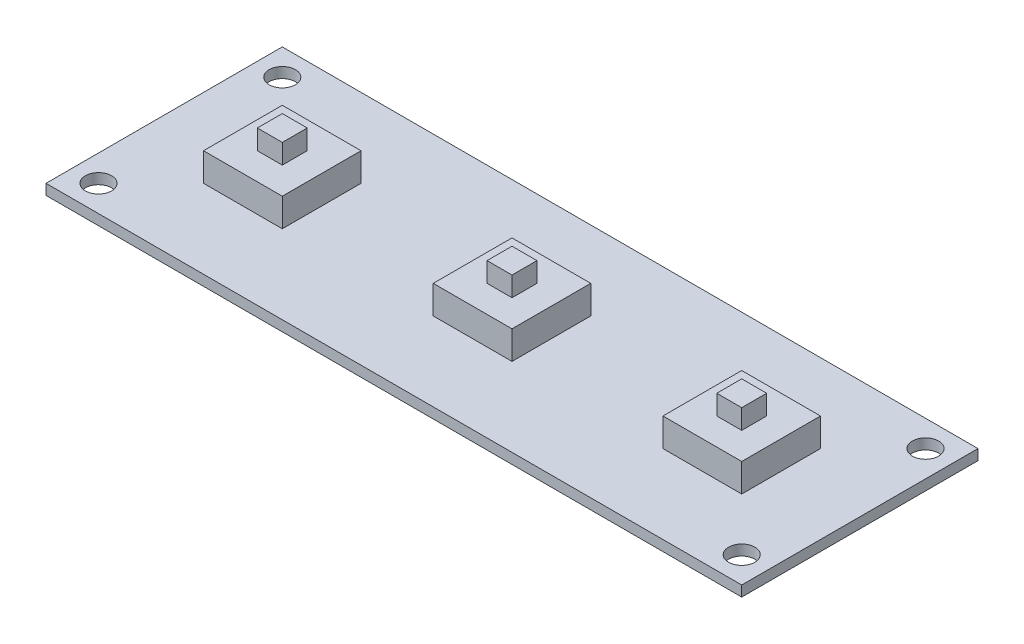
ISO-10303-21;
HEADER;
FILE_DESCRIPTION(('STEP AP214'),'2;1');
FILE_NAME('part.step','',(''),(''),'','','');
FILE_SCHEMA(('AUTOMOTIVE_DESIGN { 1 0 10303 214 1 1 1 1 }'));
ENDSEC;
DATA;
#1=APPLICATION_CONTEXT('core data for automotive mechanical design processes');
#2=APPLICATION_PROTOCOL_DEFINITION('international standard','automotive_design',2000,#1);
#3=PRODUCT_CONTEXT('',#1,'mechanical');
#4=PRODUCT('Part','Part','',(#3));
#5=PRODUCT_RELATED_PRODUCT_CATEGORY('part','',(#4));
#6=PRODUCT_DEFINITION_FORMATION('','',#4);
#7=PRODUCT_DEFINITION_CONTEXT('part definition',#1,'design');
#8=PRODUCT_DEFINITION('design','',#6,#7);
#9=PRODUCT_DEFINITION_SHAPE('','',#8);
#10=(LENGTH_UNIT() NAMED_UNIT(*) SI_UNIT(.MILLI.,.METRE.));
#11=(NAMED_UNIT(*) PLANE_ANGLE_UNIT() SI_UNIT($,.RADIAN.));
#12=(NAMED_UNIT(*) SI_UNIT($,.STERADIAN.) SOLID_ANGLE_UNIT());
#13=UNCERTAINTY_MEASURE_WITH_UNIT(LENGTH_MEASURE(1.E-05),#10,'distance_accuracy_value','');
#14=(GEOMETRIC_REPRESENTATION_CONTEXT(3) GLOBAL_UNCERTAINTY_ASSIGNED_CONTEXT((#13)) GLOBAL_UNIT_ASSIGNED_CONTEXT((#10,
#11,#12)) REPRESENTATION_CONTEXT('',''));
#15=CARTESIAN_POINT('',(0.,0.,0.));
#16=DIRECTION('',(0.,0.,1.));
#17=DIRECTION('',(1.,0.,0.));
#18=AXIS2_PLACEMENT_3D('',#15,#16,#17);
#19=CARTESIAN_POINT('',(0.,0.,0.));
#20=DIRECTION('',(0.,-1.,0.));
#21=DIRECTION('',(0.,0.,-1.));
#22=AXIS2_PLACEMENT_3D('',#19,#20,#21);
#23=PLANE('',#22);
#24=DIRECTION('',(0.,0.,1.));
#25=VECTOR('',#24,1.);
#26=CARTESIAN_POINT('',(35.,0.,-12.));
#27=LINE('',#26,#25);
#28=CARTESIAN_POINT('',(35.,0.,-12.));
#29=VERTEX_POINT('',#28);
#30=CARTESIAN_POINT('',(35.,0.,0.));
#31=VERTEX_POINT('',#30);
#32=EDGE_CURVE('E317',#29,#31,#27,.T.);
#33=ORIENTED_EDGE('',*,*,#32,.F.);
#34=DIRECTION('',(-1.,0.,0.));
#35=VECTOR('',#34,1.);
#36=CARTESIAN_POINT('',(35.,0.,-12.));
#37=LINE('',#36,#35);
#38=CARTESIAN_POINT('',(47.,0.,-12.));
#39=VERTEX_POINT('',#38);
#40=EDGE_CURVE('E322',#39,#29,#37,.T.);
#41=ORIENTED_EDGE('',*,*,#40,.F.);
#42=DIRECTION('',(0.,0.,-1.));
#43=VECTOR('',#42,1.);
#44=CARTESIAN_POINT('',(47.,0.,-12.));
#45=LINE('',#44,#43);
#46=CARTESIAN_POINT('',(47.,0.,0.));
#47=VERTEX_POINT('',#46);
#48=EDGE_CURVE('E334',#47,#39,#45,.T.);
#49=ORIENTED_EDGE('',*,*,#48,.F.);
#50=DIRECTION('',(1.,0.,0.));
#51=VECTOR('',#50,1.);
#52=CARTESIAN_POINT('',(35.,0.,0.));
#53=LINE('',#52,#51);
#54=EDGE_CURVE('E331',#31,#47,#53,.T.);
#55=ORIENTED_EDGE('',*,*,#54,.F.);
#56=EDGE_LOOP('',(#33,#41,#49,#55));
#57=FACE_BOUND('',#56,.T.);
#58=DIRECTION('',(0.,0.,1.));
#59=VECTOR('',#58,1.);
#60=CARTESIAN_POINT('',(0.,0.,0.));
#61=LINE('',#60,#59);
#62=CARTESIAN_POINT('',(0.,0.,-12.));
#63=VERTEX_POINT('',#62);
#64=CARTESIAN_POINT('',(0.,0.,0.));
#65=VERTEX_POINT('',#64);
#66=EDGE_CURVE('E435',#63,#65,#61,.T.);
#67=ORIENTED_EDGE('',*,*,#66,.F.);
#68=DIRECTION('',(-1.,0.,0.));
#69=VECTOR('',#68,1.);
#70=CARTESIAN_POINT('',(0.,0.,-12.));
#71=LINE('',#70,#69);
#72=CARTESIAN_POINT('',(12.,0.,-12.));
#73=VERTEX_POINT('',#72);
#74=EDGE_CURVE('E440',#73,#63,#71,.T.);
#75=ORIENTED_EDGE('',*,*,#74,.F.);
#76=DIRECTION('',(0.,0.,-1.));
#77=VECTOR('',#76,1.);
#78=CARTESIAN_POINT('',(12.,0.,0.));
#79=LINE('',#78,#77);
#80=CARTESIAN_POINT('',(12.,0.,0.));
#81=VERTEX_POINT('',#80);
#82=EDGE_CURVE('E452',#81,#73,#79,.T.);
#83=ORIENTED_EDGE('',*,*,#82,.F.);
#84=DIRECTION('',(1.,0.,0.));
#85=VECTOR('',#84,1.);
#86=CARTESIAN_POINT('',(0.,0.,0.));
#87=LINE('',#86,#85);
#88=EDGE_CURVE('E449',#65,#81,#87,.T.);
#89=ORIENTED_EDGE('',*,*,#88,.F.);
#90=EDGE_LOOP('',(#67,#75,#83,#89));
#91=FACE_BOUND('',#90,.T.);
#92=DIRECTION('',(0.,0.,-1.));
#93=VECTOR('',#92,1.);
#94=CARTESIAN_POINT('',(-12.,0.,12.));
#95=LINE('',#94,#93);
#96=CARTESIAN_POINT('',(-12.,0.,12.));
#97=VERTEX_POINT('',#96);
#98=CARTESIAN_POINT('',(-12.,0.,-24.));
#99=VERTEX_POINT('',#98);
#100=EDGE_CURVE('E372',#97,#99,#95,.T.);
#101=ORIENTED_EDGE('',*,*,#100,.F.);
#102=DIRECTION('',(-1.,0.,0.));
#103=VECTOR('',#102,1.);
#104=CARTESIAN_POINT('',(-12.,0.,12.));
#105=LINE('',#104,#103);
#106=CARTESIAN_POINT('',(94.,0.,12.));
#107=VERTEX_POINT('',#106);
#108=EDGE_CURVE('E379',#107,#97,#105,.T.);
#109=ORIENTED_EDGE('',*,*,#108,.F.);
#110=DIRECTION('',(0.,0.,1.));
#111=VECTOR('',#110,1.);
#112=CARTESIAN_POINT('',(94.,0.,12.));
#113=LINE('',#112,#111);
#114=CARTESIAN_POINT('',(94.,0.,-24.));
#115=VERTEX_POINT('',#114);
#116=EDGE_CURVE('E390',#115,#107,#113,.T.);
#117=ORIENTED_EDGE('',*,*,#116,.F.);
#118=DIRECTION('',(1.,0.,0.));
#119=VECTOR('',#118,1.);
#120=CARTESIAN_POINT('',(-12.,0.,-24.));
#121=LINE('',#120,#119);
#122=EDGE_CURVE('E388',#99,#115,#121,.T.);
#123=ORIENTED_EDGE('',*,*,#122,.F.);
#124=EDGE_LOOP('',(#101,#109,#117,#123));
#125=FACE_BOUND('',#124,.T.);
#126=CARTESIAN_POINT('',(-8.,0.,-20.));
#127=DIRECTION('',(0.,-1.,0.));
#128=DIRECTION('',(0.,0.,-1.));
#129=AXIS2_PLACEMENT_3D('',#126,#127,#128);
#130=CIRCLE('',#129,2.);
#131=CARTESIAN_POINT('',(-8.,0.,-22.));
#132=VERTEX_POINT('',#131);
#133=EDGE_CURVE('E366',#132,#132,#130,.T.);
#134=ORIENTED_EDGE('',*,*,#133,.T.);
#135=EDGE_LOOP('',(#134));
#136=FACE_BOUND('',#135,.T.);
#137=CARTESIAN_POINT('',(-8.,0.,8.));
#138=DIRECTION('',(0.,-1.,0.));
#139=DIRECTION('',(0.,0.,-1.));
#140=AXIS2_PLACEMENT_3D('',#137,#138,#139);
#141=CIRCLE('',#140,2.);
#142=CARTESIAN_POINT('',(-8.,0.,6.));
#143=VERTEX_POINT('',#142);
#144=EDGE_CURVE('E360',#143,#143,#141,.T.);
#145=ORIENTED_EDGE('',*,*,#144,.T.);
#146=EDGE_LOOP('',(#145));
#147=FACE_BOUND('',#146,.T.);
#148=CARTESIAN_POINT('',(90.,0.,8.));
#149=DIRECTION('',(0.,-1.,0.));
#150=DIRECTION('',(0.,0.,-1.));
#151=AXIS2_PLACEMENT_3D('',#148,#149,#150);
#152=CIRCLE('',#151,2.);
#153=CARTESIAN_POINT('',(90.,0.,6.));
#154=VERTEX_POINT('',#153);
#155=EDGE_CURVE('E354',#154,#154,#152,.T.);
#156=ORIENTED_EDGE('',*,*,#155,.T.);
#157=EDGE_LOOP('',(#156));
#158=FACE_BOUND('',#157,.T.);
#159=CARTESIAN_POINT('',(90.,0.,-20.));
#160=DIRECTION('',(0.,-1.,0.));
#161=DIRECTION('',(0.,0.,-1.));
#162=AXIS2_PLACEMENT_3D('',#159,#160,#161);
#163=CIRCLE('',#162,2.);
#164=CARTESIAN_POINT('',(90.,0.,-22.));
#165=VERTEX_POINT('',#164);
#166=EDGE_CURVE('E350',#165,#165,#163,.T.);
#167=ORIENTED_EDGE('',*,*,#166,.T.);
#168=EDGE_LOOP('',(#167));
#169=FACE_BOUND('',#168,.T.);
#170=DIRECTION('',(0.,0.,1.));
#171=VECTOR('',#170,1.);
#172=CARTESIAN_POINT('',(70.,0.,-12.));
#173=LINE('',#172,#171);
#174=CARTESIAN_POINT('',(70.,0.,-12.));
#175=VERTEX_POINT('',#174);
#176=CARTESIAN_POINT('',(70.,0.,0.));
#177=VERTEX_POINT('',#176);
#178=EDGE_CURVE('E284',#175,#177,#173,.T.);
#179=ORIENTED_EDGE('',*,*,#178,.F.);
#180=DIRECTION('',(-1.,0.,0.));
#181=VECTOR('',#180,1.);
#182=CARTESIAN_POINT('',(70.,0.,-12.));
#183=LINE('',#182,#181);
#184=CARTESIAN_POINT('',(82.,0.,-12.));
#185=VERTEX_POINT('',#184);
#186=EDGE_CURVE('E289',#185,#175,#183,.T.);
#187=ORIENTED_EDGE('',*,*,#186,.F.);
#188=DIRECTION('',(0.,0.,-1.));
#189=VECTOR('',#188,1.);
#190=CARTESIAN_POINT('',(82.,0.,-12.));
#191=LINE('',#190,#189);
#192=CARTESIAN_POINT('',(82.,0.,0.));
#193=VERTEX_POINT('',#192);
#194=EDGE_CURVE('E301',#193,#185,#191,.T.);
#195=ORIENTED_EDGE('',*,*,#194,.F.);
#196=DIRECTION('',(1.,0.,0.));
#197=VECTOR('',#196,1.);
#198=CARTESIAN_POINT('',(70.,0.,0.));
#199=LINE('',#198,#197);
#200=EDGE_CURVE('E298',#177,#193,#199,.T.);
#201=ORIENTED_EDGE('',*,*,#200,.F.);
#202=EDGE_LOOP('',(#179,#187,#195,#201));
#203=FACE_BOUND('',#202,.T.);
#204=ADVANCED_FACE('F36',(#57,#91,#125,#136,#147,#158,#169,#203),#23,.F.);
#205=CARTESIAN_POINT('',(0.,4.3,0.));
#206=DIRECTION('',(1.,0.,0.));
#207=DIRECTION('',(0.,0.,-1.));
#208=AXIS2_PLACEMENT_3D('',#205,#206,#207);
#209=PLANE('',#208);
#210=ORIENTED_EDGE('',*,*,#66,.T.);
#211=DIRECTION('',(0.,-1.,0.));
#212=VECTOR('',#211,1.);
#213=CARTESIAN_POINT('',(0.,4.3,0.));
#214=LINE('',#213,#212);
#215=CARTESIAN_POINT('',(0.,4.3,0.));
#216=VERTEX_POINT('',#215);
#217=EDGE_CURVE('E11',#216,#65,#214,.T.);
#218=ORIENTED_EDGE('',*,*,#217,.F.);
#219=DIRECTION('',(0.,0.,1.));
#220=VECTOR('',#219,1.);
#221=CARTESIAN_POINT('',(0.,4.3,0.));
#222=LINE('',#221,#220);
#223=CARTESIAN_POINT('',(0.,4.3,-12.));
#224=VERTEX_POINT('',#223);
#225=EDGE_CURVE('E436',#224,#216,#222,.T.);
#226=ORIENTED_EDGE('',*,*,#225,.F.);
#227=DIRECTION('',(0.,-1.,0.));
#228=VECTOR('',#227,1.);
#229=CARTESIAN_POINT('',(0.,4.3,-12.));
#230=LINE('',#229,#228);
#231=EDGE_CURVE('E446',#224,#63,#230,.T.);
#232=ORIENTED_EDGE('',*,*,#231,.T.);
#233=EDGE_LOOP('',(#210,#218,#226,#232));
#234=FACE_BOUND('',#233,.T.);
#235=ADVANCED_FACE('F38',(#234),#209,.F.);
#236=CARTESIAN_POINT('',(0.,4.3,0.));
#237=DIRECTION('',(0.,0.,-1.));
#238=DIRECTION('',(-1.,0.,0.));
#239=AXIS2_PLACEMENT_3D('',#236,#237,#238);
#240=PLANE('',#239);
#241=ORIENTED_EDGE('',*,*,#88,.T.);
#242=DIRECTION('',(0.,-1.,0.));
#243=VECTOR('',#242,1.);
#244=CARTESIAN_POINT('',(12.,4.3,0.));
#245=LINE('',#244,#243);
#246=CARTESIAN_POINT('',(12.,4.3,0.));
#247=VERTEX_POINT('',#246);
#248=EDGE_CURVE('E44',#247,#81,#245,.T.);
#249=ORIENTED_EDGE('',*,*,#248,.F.);
#250=DIRECTION('',(1.,0.,0.));
#251=VECTOR('',#250,1.);
#252=CARTESIAN_POINT('',(0.,4.3,0.));
#253=LINE('',#252,#251);
#254=EDGE_CURVE('E439',#216,#247,#253,.T.);
#255=ORIENTED_EDGE('',*,*,#254,.F.);
#256=ORIENTED_EDGE('',*,*,#217,.T.);
#257=EDGE_LOOP('',(#241,#249,#255,#256));
#258=FACE_BOUND('',#257,.T.);
#259=ADVANCED_FACE('F468',(#258),#240,.F.);
#260=CARTESIAN_POINT('',(12.,4.3,0.));
#261=DIRECTION('',(-1.,0.,0.));
#262=DIRECTION('',(0.,0.,1.));
#263=AXIS2_PLACEMENT_3D('',#260,#261,#262);
#264=PLANE('',#263);
#265=ORIENTED_EDGE('',*,*,#82,.T.);
#266=DIRECTION('',(0.,-1.,0.));
#267=VECTOR('',#266,1.);
#268=CARTESIAN_POINT('',(12.,4.3,-12.));
#269=LINE('',#268,#267);
#270=CARTESIAN_POINT('',(12.,4.3,-12.));
#271=VERTEX_POINT('',#270);
#272=EDGE_CURVE('E459',#271,#73,#269,.T.);
#273=ORIENTED_EDGE('',*,*,#272,.F.);
#274=DIRECTION('',(0.,0.,-1.));
#275=VECTOR('',#274,1.);
#276=CARTESIAN_POINT('',(12.,4.3,0.));
#277=LINE('',#276,#275);
#278=EDGE_CURVE('E442',#247,#271,#277,.T.);
#279=ORIENTED_EDGE('',*,*,#278,.F.);
#280=ORIENTED_EDGE('',*,*,#248,.T.);
#281=EDGE_LOOP('',(#265,#273,#279,#280));
#282=FACE_BOUND('',#281,.T.);
#283=ADVANCED_FACE('F465',(#282),#264,.F.);
#284=CARTESIAN_POINT('',(0.,4.3,-12.));
#285=DIRECTION('',(0.,0.,1.));
#286=DIRECTION('',(1.,0.,0.));
#287=AXIS2_PLACEMENT_3D('',#284,#285,#286);
#288=PLANE('',#287);
#289=ORIENTED_EDGE('',*,*,#74,.T.);
#290=ORIENTED_EDGE('',*,*,#231,.F.);
#291=DIRECTION('',(-1.,0.,0.));
#292=VECTOR('',#291,1.);
#293=CARTESIAN_POINT('',(0.,4.3,-12.));
#294=LINE('',#293,#292);
#295=EDGE_CURVE('E444',#271,#224,#294,.T.);
#296=ORIENTED_EDGE('',*,*,#295,.F.);
#297=ORIENTED_EDGE('',*,*,#272,.T.);
#298=EDGE_LOOP('',(#289,#290,#296,#297));
#299=FACE_BOUND('',#298,.T.);
#300=ADVANCED_FACE('F474',(#299),#288,.F.);
#301=CARTESIAN_POINT('',(0.,4.3,0.));
#302=DIRECTION('',(0.,-1.,0.));
#303=DIRECTION('',(0.,0.,-1.));
#304=AXIS2_PLACEMENT_3D('',#301,#302,#303);
#305=PLANE('',#304);
#306=DIRECTION('',(1.,0.,0.));
#307=VECTOR('',#306,1.);
#308=CARTESIAN_POINT('',(0.,4.3,-7.9));
#309=LINE('',#308,#307);
#310=CARTESIAN_POINT('',(4.1,4.3,-7.9));
#311=VERTEX_POINT('',#310);
#312=CARTESIAN_POINT('',(7.9,4.3,-7.9));
#313=VERTEX_POINT('',#312);
#314=EDGE_CURVE('E419',#311,#313,#309,.T.);
#315=ORIENTED_EDGE('',*,*,#314,.T.);
#316=DIRECTION('',(0.,0.,1.));
#317=VECTOR('',#316,1.);
#318=CARTESIAN_POINT('',(7.9,4.3,0.));
#319=LINE('',#318,#317);
#320=CARTESIAN_POINT('',(7.9,4.3,-4.1));
#321=VERTEX_POINT('',#320);
#322=EDGE_CURVE('E404',#313,#321,#319,.T.);
#323=ORIENTED_EDGE('',*,*,#322,.T.);
#324=DIRECTION('',(1.,0.,0.));
#325=VECTOR('',#324,1.);
#326=CARTESIAN_POINT('',(0.,4.3,-4.1));
#327=LINE('',#326,#325);
#328=CARTESIAN_POINT('',(4.1,4.3,-4.1));
#329=VERTEX_POINT('',#328);
#330=EDGE_CURVE('E409',#329,#321,#327,.T.);
#331=ORIENTED_EDGE('',*,*,#330,.F.);
#332=DIRECTION('',(0.,0.,1.));
#333=VECTOR('',#332,1.);
#334=CARTESIAN_POINT('',(4.1,4.3,0.));
#335=LINE('',#334,#333);
#336=EDGE_CURVE('E422',#311,#329,#335,.T.);
#337=ORIENTED_EDGE('',*,*,#336,.F.);
#338=EDGE_LOOP('',(#315,#323,#331,#337));
#339=FACE_BOUND('',#338,.T.);
#340=ORIENTED_EDGE('',*,*,#225,.T.);
#341=ORIENTED_EDGE('',*,*,#254,.T.);
#342=ORIENTED_EDGE('',*,*,#278,.T.);
#343=ORIENTED_EDGE('',*,*,#295,.T.);
#344=EDGE_LOOP('',(#340,#341,#342,#343));
#345=FACE_BOUND('',#344,.T.);
#346=ADVANCED_FACE('F479',(#339,#345),#305,.F.);
#347=CARTESIAN_POINT('',(7.9,7.3,0.));
#348=DIRECTION('',(1.,0.,0.));
#349=DIRECTION('',(0.,0.,-1.));
#350=AXIS2_PLACEMENT_3D('',#347,#348,#349);
#351=PLANE('',#350);
#352=ORIENTED_EDGE('',*,*,#322,.F.);
#353=DIRECTION('',(0.,-1.,0.));
#354=VECTOR('',#353,1.);
#355=CARTESIAN_POINT('',(7.9,7.3,-7.9));
#356=LINE('',#355,#354);
#357=CARTESIAN_POINT('',(7.9,7.3,-7.9));
#358=VERTEX_POINT('',#357);
#359=EDGE_CURVE('E432',#358,#313,#356,.T.);
#360=ORIENTED_EDGE('',*,*,#359,.F.);
#361=DIRECTION('',(0.,0.,1.));
#362=VECTOR('',#361,1.);
#363=CARTESIAN_POINT('',(7.9,7.3,0.));
#364=LINE('',#363,#362);
#365=CARTESIAN_POINT('',(7.9,7.3,-4.1));
#366=VERTEX_POINT('',#365);
#367=EDGE_CURVE('E405',#358,#366,#364,.T.);
#368=ORIENTED_EDGE('',*,*,#367,.T.);
#369=DIRECTION('',(0.,-1.,0.));
#370=VECTOR('',#369,1.);
#371=CARTESIAN_POINT('',(7.9,7.3,-4.1));
#372=LINE('',#371,#370);
#373=EDGE_CURVE('E416',#366,#321,#372,.T.);
#374=ORIENTED_EDGE('',*,*,#373,.T.);
#375=EDGE_LOOP('',(#352,#360,#368,#374));
#376=FACE_BOUND('',#375,.T.);
#377=ADVANCED_FACE('F481',(#376),#351,.T.);
#378=CARTESIAN_POINT('',(0.,7.3,-7.9));
#379=DIRECTION('',(0.,0.,-1.));
#380=DIRECTION('',(-1.,0.,0.));
#381=AXIS2_PLACEMENT_3D('',#378,#379,#380);
#382=PLANE('',#381);
#383=ORIENTED_EDGE('',*,*,#314,.F.);
#384=DIRECTION('',(0.,-1.,0.));
#385=VECTOR('',#384,1.);
#386=CARTESIAN_POINT('',(4.1,7.3,-7.9));
#387=LINE('',#386,#385);
#388=CARTESIAN_POINT('',(4.1,7.3,-7.9));
#389=VERTEX_POINT('',#388);
#390=EDGE_CURVE('E430',#389,#311,#387,.T.);
#391=ORIENTED_EDGE('',*,*,#390,.F.);
#392=DIRECTION('',(1.,0.,0.));
#393=VECTOR('',#392,1.);
#394=CARTESIAN_POINT('',(0.,7.3,-7.9));
#395=LINE('',#394,#393);
#396=EDGE_CURVE('E408',#389,#358,#395,.T.);
#397=ORIENTED_EDGE('',*,*,#396,.T.);
#398=ORIENTED_EDGE('',*,*,#359,.T.);
#399=EDGE_LOOP('',(#383,#391,#397,#398));
#400=FACE_BOUND('',#399,.T.);
#401=ADVANCED_FACE('F488',(#400),#382,.T.);
#402=CARTESIAN_POINT('',(4.1,7.3,0.));
#403=DIRECTION('',(1.,0.,0.));
#404=DIRECTION('',(0.,0.,-1.));
#405=AXIS2_PLACEMENT_3D('',#402,#403,#404);
#406=PLANE('',#405);
#407=ORIENTED_EDGE('',*,*,#336,.T.);
#408=DIRECTION('',(0.,-1.,0.));
#409=VECTOR('',#408,1.);
#410=CARTESIAN_POINT('',(4.1,7.3,-4.1));
#411=LINE('',#410,#409);
#412=CARTESIAN_POINT('',(4.1,7.3,-4.1));
#413=VERTEX_POINT('',#412);
#414=EDGE_CURVE('E427',#413,#329,#411,.T.);
#415=ORIENTED_EDGE('',*,*,#414,.F.);
#416=DIRECTION('',(0.,0.,1.));
#417=VECTOR('',#416,1.);
#418=CARTESIAN_POINT('',(4.1,7.3,0.));
#419=LINE('',#418,#417);
#420=EDGE_CURVE('E412',#389,#413,#419,.T.);
#421=ORIENTED_EDGE('',*,*,#420,.F.);
#422=ORIENTED_EDGE('',*,*,#390,.T.);
#423=EDGE_LOOP('',(#407,#415,#421,#422));
#424=FACE_BOUND('',#423,.T.);
#425=ADVANCED_FACE('F526',(#424),#406,.F.);
#426=CARTESIAN_POINT('',(0.,7.3,-4.1));
#427=DIRECTION('',(0.,0.,-1.));
#428=DIRECTION('',(-1.,0.,0.));
#429=AXIS2_PLACEMENT_3D('',#426,#427,#428);
#430=PLANE('',#429);
#431=ORIENTED_EDGE('',*,*,#330,.T.);
#432=ORIENTED_EDGE('',*,*,#373,.F.);
#433=DIRECTION('',(1.,0.,0.));
#434=VECTOR('',#433,1.);
#435=CARTESIAN_POINT('',(0.,7.3,-4.1));
#436=LINE('',#435,#434);
#437=EDGE_CURVE('E414',#413,#366,#436,.T.);
#438=ORIENTED_EDGE('',*,*,#437,.F.);
#439=ORIENTED_EDGE('',*,*,#414,.T.);
#440=EDGE_LOOP('',(#431,#432,#438,#439));
#441=FACE_BOUND('',#440,.T.);
#442=ADVANCED_FACE('F522',(#441),#430,.F.);
#443=CARTESIAN_POINT('',(0.,7.3,0.));
#444=DIRECTION('',(0.,1.,0.));
#445=DIRECTION('',(0.,0.,1.));
#446=AXIS2_PLACEMENT_3D('',#443,#444,#445);
#447=PLANE('',#446);
#448=ORIENTED_EDGE('',*,*,#367,.F.);
#449=ORIENTED_EDGE('',*,*,#396,.F.);
#450=ORIENTED_EDGE('',*,*,#420,.T.);
#451=ORIENTED_EDGE('',*,*,#437,.T.);
#452=EDGE_LOOP('',(#448,#449,#450,#451));
#453=FACE_BOUND('',#452,.T.);
#454=ADVANCED_FACE('F519',(#453),#447,.T.);
#455=CARTESIAN_POINT('',(0.,-1.6,0.));
#456=DIRECTION('',(0.,-1.,0.));
#457=DIRECTION('',(0.,0.,-1.));
#458=AXIS2_PLACEMENT_3D('',#455,#456,#457);
#459=PLANE('',#458);
#460=CARTESIAN_POINT('',(90.,-1.6,8.));
#461=DIRECTION('',(0.,-1.,0.));
#462=DIRECTION('',(0.,0.,-1.));
#463=AXIS2_PLACEMENT_3D('',#460,#461,#462);
#464=CIRCLE('',#463,2.);
#465=CARTESIAN_POINT('',(90.,-1.6,6.));
#466=VERTEX_POINT('',#465);
#467=EDGE_CURVE('E357',#466,#466,#464,.T.);
#468=ORIENTED_EDGE('',*,*,#467,.F.);
#469=EDGE_LOOP('',(#468));
#470=FACE_BOUND('',#469,.T.);
#471=CARTESIAN_POINT('',(-8.,-1.6,-20.));
#472=DIRECTION('',(0.,-1.,0.));
#473=DIRECTION('',(0.,0.,-1.));
#474=AXIS2_PLACEMENT_3D('',#471,#472,#473);
#475=CIRCLE('',#474,2.);
#476=CARTESIAN_POINT('',(-8.,-1.6,-22.));
#477=VERTEX_POINT('',#476);
#478=EDGE_CURVE('E369',#477,#477,#475,.T.);
#479=ORIENTED_EDGE('',*,*,#478,.F.);
#480=EDGE_LOOP('',(#479));
#481=FACE_BOUND('',#480,.T.);
#482=DIRECTION('',(0.,0.,-1.));
#483=VECTOR('',#482,1.);
#484=CARTESIAN_POINT('',(-12.,-1.6,12.));
#485=LINE('',#484,#483);
#486=CARTESIAN_POINT('',(-12.,-1.6,12.));
#487=VERTEX_POINT('',#486);
#488=CARTESIAN_POINT('',(-12.,-1.6,-24.));
#489=VERTEX_POINT('',#488);
#490=EDGE_CURVE('E375',#487,#489,#485,.T.);
#491=ORIENTED_EDGE('',*,*,#490,.T.);
#492=DIRECTION('',(1.,0.,0.));
#493=VECTOR('',#492,1.);
#494=CARTESIAN_POINT('',(-12.,-1.6,-24.));
#495=LINE('',#494,#493);
#496=CARTESIAN_POINT('',(94.,-1.6,-24.));
#497=VERTEX_POINT('',#496);
#498=EDGE_CURVE('E378',#489,#497,#495,.T.);
#499=ORIENTED_EDGE('',*,*,#498,.T.);
#500=DIRECTION('',(0.,0.,1.));
#501=VECTOR('',#500,1.);
#502=CARTESIAN_POINT('',(94.,-1.6,12.));
#503=LINE('',#502,#501);
#504=CARTESIAN_POINT('',(94.,-1.6,12.));
#505=VERTEX_POINT('',#504);
#506=EDGE_CURVE('E381',#497,#505,#503,.T.);
#507=ORIENTED_EDGE('',*,*,#506,.T.);
#508=DIRECTION('',(-1.,0.,0.));
#509=VECTOR('',#508,1.);
#510=CARTESIAN_POINT('',(-12.,-1.6,12.));
#511=LINE('',#510,#509);
#512=EDGE_CURVE('E383',#505,#487,#511,.T.);
#513=ORIENTED_EDGE('',*,*,#512,.T.);
#514=EDGE_LOOP('',(#491,#499,#507,#513));
#515=FACE_BOUND('',#514,.T.);
#516=CARTESIAN_POINT('',(-8.,-1.6,8.));
#517=DIRECTION('',(0.,-1.,0.));
#518=DIRECTION('',(0.,0.,-1.));
#519=AXIS2_PLACEMENT_3D('',#516,#517,#518);
#520=CIRCLE('',#519,2.);
#521=CARTESIAN_POINT('',(-8.,-1.6,6.));
#522=VERTEX_POINT('',#521);
#523=EDGE_CURVE('E363',#522,#522,#520,.T.);
#524=ORIENTED_EDGE('',*,*,#523,.F.);
#525=EDGE_LOOP('',(#524));
#526=FACE_BOUND('',#525,.T.);
#527=CARTESIAN_POINT('',(90.,-1.6,-20.));
#528=DIRECTION('',(0.,-1.,0.));
#529=DIRECTION('',(0.,0.,-1.));
#530=AXIS2_PLACEMENT_3D('',#527,#528,#529);
#531=CIRCLE('',#530,2.);
#532=CARTESIAN_POINT('',(90.,-1.6,-22.));
#533=VERTEX_POINT('',#532);
#534=EDGE_CURVE('E351',#533,#533,#531,.T.);
#535=ORIENTED_EDGE('',*,*,#534,.F.);
#536=EDGE_LOOP('',(#535));
#537=FACE_BOUND('',#536,.T.);
#538=ADVANCED_FACE('F500',(#470,#481,#515,#526,#537),#459,.T.);
#539=CARTESIAN_POINT('',(-12.,-1.6,12.));
#540=DIRECTION('',(1.,0.,0.));
#541=DIRECTION('',(0.,0.,-1.));
#542=AXIS2_PLACEMENT_3D('',#539,#540,#541);
#543=PLANE('',#542);
#544=ORIENTED_EDGE('',*,*,#100,.T.);
#545=DIRECTION('',(0.,1.,0.));
#546=VECTOR('',#545,1.);
#547=CARTESIAN_POINT('',(-12.,-1.6,-24.));
#548=LINE('',#547,#546);
#549=EDGE_CURVE('E401',#489,#99,#548,.T.);
#550=ORIENTED_EDGE('',*,*,#549,.F.);
#551=ORIENTED_EDGE('',*,*,#490,.F.);
#552=DIRECTION('',(0.,1.,0.));
#553=VECTOR('',#552,1.);
#554=CARTESIAN_POINT('',(-12.,-1.6,12.));
#555=LINE('',#554,#553);
#556=EDGE_CURVE('E385',#487,#97,#555,.T.);
#557=ORIENTED_EDGE('',*,*,#556,.T.);
#558=EDGE_LOOP('',(#544,#550,#551,#557));
#559=FACE_BOUND('',#558,.T.);
#560=ADVANCED_FACE('F514',(#559),#543,.F.);
#561=CARTESIAN_POINT('',(-12.,-1.6,-24.));
#562=DIRECTION('',(0.,0.,1.));
#563=DIRECTION('',(1.,0.,0.));
#564=AXIS2_PLACEMENT_3D('',#561,#562,#563);
#565=PLANE('',#564);
#566=ORIENTED_EDGE('',*,*,#122,.T.);
#567=DIRECTION('',(0.,1.,0.));
#568=VECTOR('',#567,1.);
#569=CARTESIAN_POINT('',(94.,-1.6,-24.));
#570=LINE('',#569,#568);
#571=EDGE_CURVE('E398',#497,#115,#570,.T.);
#572=ORIENTED_EDGE('',*,*,#571,.F.);
#573=ORIENTED_EDGE('',*,*,#498,.F.);
#574=ORIENTED_EDGE('',*,*,#549,.T.);
#575=EDGE_LOOP('',(#566,#572,#573,#574));
#576=FACE_BOUND('',#575,.T.);
#577=ADVANCED_FACE('F510',(#576),#565,.F.);
#578=CARTESIAN_POINT('',(94.,-1.6,12.));
#579=DIRECTION('',(-1.,0.,0.));
#580=DIRECTION('',(0.,0.,1.));
#581=AXIS2_PLACEMENT_3D('',#578,#579,#580);
#582=PLANE('',#581);
#583=ORIENTED_EDGE('',*,*,#116,.T.);
#584=DIRECTION('',(0.,1.,0.));
#585=VECTOR('',#584,1.);
#586=CARTESIAN_POINT('',(94.,-1.6,12.));
#587=LINE('',#586,#585);
#588=EDGE_CURVE('E395',#505,#107,#587,.T.);
#589=ORIENTED_EDGE('',*,*,#588,.F.);
#590=ORIENTED_EDGE('',*,*,#506,.F.);
#591=ORIENTED_EDGE('',*,*,#571,.T.);
#592=EDGE_LOOP('',(#583,#589,#590,#591));
#593=FACE_BOUND('',#592,.T.);
#594=ADVANCED_FACE('F506',(#593),#582,.F.);
#595=CARTESIAN_POINT('',(-12.,-1.6,12.));
#596=DIRECTION('',(0.,0.,-1.));
#597=DIRECTION('',(-1.,0.,0.));
#598=AXIS2_PLACEMENT_3D('',#595,#596,#597);
#599=PLANE('',#598);
#600=ORIENTED_EDGE('',*,*,#108,.T.);
#601=ORIENTED_EDGE('',*,*,#556,.F.);
#602=ORIENTED_EDGE('',*,*,#512,.F.);
#603=ORIENTED_EDGE('',*,*,#588,.T.);
#604=EDGE_LOOP('',(#600,#601,#602,#603));
#605=FACE_BOUND('',#604,.T.);
#606=ADVANCED_FACE('F502',(#605),#599,.F.);
#607=CARTESIAN_POINT('',(-8.,-1.6,-20.));
#608=DIRECTION('',(0.,1.,0.));
#609=DIRECTION('',(0.,0.,1.));
#610=AXIS2_PLACEMENT_3D('',#607,#608,#609);
#611=CYLINDRICAL_SURFACE('',#610,2.);
#612=ORIENTED_EDGE('',*,*,#478,.T.);
#613=EDGE_LOOP('',(#612));
#614=FACE_BOUND('',#613,.T.);
#615=ORIENTED_EDGE('',*,*,#133,.F.);
#616=EDGE_LOOP('',(#615));
#617=FACE_BOUND('',#616,.T.);
#618=ADVANCED_FACE('F505',(#614,#617),#611,.F.);
#619=CARTESIAN_POINT('',(-8.,-1.6,8.));
#620=DIRECTION('',(0.,1.,0.));
#621=DIRECTION('',(0.,0.,1.));
#622=AXIS2_PLACEMENT_3D('',#619,#620,#621);
#623=CYLINDRICAL_SURFACE('',#622,2.);
#624=ORIENTED_EDGE('',*,*,#523,.T.);
#625=EDGE_LOOP('',(#624));
#626=FACE_BOUND('',#625,.T.);
#627=ORIENTED_EDGE('',*,*,#144,.F.);
#628=EDGE_LOOP('',(#627));
#629=FACE_BOUND('',#628,.T.);
#630=ADVANCED_FACE('F588',(#626,#629),#623,.F.);
#631=CARTESIAN_POINT('',(90.,-1.6,8.));
#632=DIRECTION('',(0.,1.,0.));
#633=DIRECTION('',(0.,0.,1.));
#634=AXIS2_PLACEMENT_3D('',#631,#632,#633);
#635=CYLINDRICAL_SURFACE('',#634,2.);
#636=ORIENTED_EDGE('',*,*,#467,.T.);
#637=EDGE_LOOP('',(#636));
#638=FACE_BOUND('',#637,.T.);
#639=ORIENTED_EDGE('',*,*,#155,.F.);
#640=EDGE_LOOP('',(#639));
#641=FACE_BOUND('',#640,.T.);
#642=ADVANCED_FACE('F595',(#638,#641),#635,.F.);
#643=CARTESIAN_POINT('',(90.,-1.6,-20.));
#644=DIRECTION('',(0.,1.,0.));
#645=DIRECTION('',(0.,0.,1.));
#646=AXIS2_PLACEMENT_3D('',#643,#644,#645);
#647=CYLINDRICAL_SURFACE('',#646,2.);
#648=ORIENTED_EDGE('',*,*,#534,.T.);
#649=EDGE_LOOP('',(#648));
#650=FACE_BOUND('',#649,.T.);
#651=ORIENTED_EDGE('',*,*,#166,.F.);
#652=EDGE_LOOP('',(#651));
#653=FACE_BOUND('',#652,.T.);
#654=ADVANCED_FACE('F603',(#650,#653),#647,.F.);
#655=CARTESIAN_POINT('',(35.,4.3,-12.));
#656=DIRECTION('',(1.,0.,0.));
#657=DIRECTION('',(0.,0.,-1.));
#658=AXIS2_PLACEMENT_3D('',#655,#656,#657);
#659=PLANE('',#658);
#660=ORIENTED_EDGE('',*,*,#32,.T.);
#661=DIRECTION('',(0.,-1.,0.));
#662=VECTOR('',#661,1.);
#663=CARTESIAN_POINT('',(35.,4.3,0.));
#664=LINE('',#663,#662);
#665=CARTESIAN_POINT('',(35.,4.3,0.));
#666=VERTEX_POINT('',#665);
#667=EDGE_CURVE('E347',#666,#31,#664,.T.);
#668=ORIENTED_EDGE('',*,*,#667,.F.);
#669=DIRECTION('',(0.,0.,1.));
#670=VECTOR('',#669,1.);
#671=CARTESIAN_POINT('',(35.,4.3,-12.));
#672=LINE('',#671,#670);
#673=CARTESIAN_POINT('',(35.,4.3,-12.));
#674=VERTEX_POINT('',#673);
#675=EDGE_CURVE('E318',#674,#666,#672,.T.);
#676=ORIENTED_EDGE('',*,*,#675,.F.);
#677=DIRECTION('',(0.,-1.,0.));
#678=VECTOR('',#677,1.);
#679=CARTESIAN_POINT('',(35.,4.3,-12.));
#680=LINE('',#679,#678);
#681=EDGE_CURVE('E328',#674,#29,#680,.T.);
#682=ORIENTED_EDGE('',*,*,#681,.T.);
#683=EDGE_LOOP('',(#660,#668,#676,#682));
#684=FACE_BOUND('',#683,.T.);
#685=ADVANCED_FACE('F611',(#684),#659,.F.);
#686=CARTESIAN_POINT('',(35.,4.3,0.));
#687=DIRECTION('',(0.,0.,-1.));
#688=DIRECTION('',(-1.,0.,0.));
#689=AXIS2_PLACEMENT_3D('',#686,#687,#688);
#690=PLANE('',#689);
#691=ORIENTED_EDGE('',*,*,#54,.T.);
#692=DIRECTION('',(0.,-1.,0.));
#693=VECTOR('',#692,1.);
#694=CARTESIAN_POINT('',(47.,4.3,0.));
#695=LINE('',#694,#693);
#696=CARTESIAN_POINT('',(47.,4.3,0.));
#697=VERTEX_POINT('',#696);
#698=EDGE_CURVE('E344',#697,#47,#695,.T.);
#699=ORIENTED_EDGE('',*,*,#698,.F.);
#700=DIRECTION('',(1.,0.,0.));
#701=VECTOR('',#700,1.);
#702=CARTESIAN_POINT('',(35.,4.3,0.));
#703=LINE('',#702,#701);
#704=EDGE_CURVE('E321',#666,#697,#703,.T.);
#705=ORIENTED_EDGE('',*,*,#704,.F.);
#706=ORIENTED_EDGE('',*,*,#667,.T.);
#707=EDGE_LOOP('',(#691,#699,#705,#706));
#708=FACE_BOUND('',#707,.T.);
#709=ADVANCED_FACE('F619',(#708),#690,.F.);
#710=CARTESIAN_POINT('',(47.,4.3,-12.));
#711=DIRECTION('',(-1.,0.,0.));
#712=DIRECTION('',(0.,0.,1.));
#713=AXIS2_PLACEMENT_3D('',#710,#711,#712);
#714=PLANE('',#713);
#715=ORIENTED_EDGE('',*,*,#48,.T.);
#716=DIRECTION('',(0.,-1.,0.));
#717=VECTOR('',#716,1.);
#718=CARTESIAN_POINT('',(47.,4.3,-12.));
#719=LINE('',#718,#717);
#720=CARTESIAN_POINT('',(47.,4.3,-12.));
#721=VERTEX_POINT('',#720);
#722=EDGE_CURVE('E341',#721,#39,#719,.T.);
#723=ORIENTED_EDGE('',*,*,#722,.F.);
#724=DIRECTION('',(0.,0.,-1.));
#725=VECTOR('',#724,1.);
#726=CARTESIAN_POINT('',(47.,4.3,-12.));
#727=LINE('',#726,#725);
#728=EDGE_CURVE('E324',#697,#721,#727,.T.);
#729=ORIENTED_EDGE('',*,*,#728,.F.);
#730=ORIENTED_EDGE('',*,*,#698,.T.);
#731=EDGE_LOOP('',(#715,#723,#729,#730));
#732=FACE_BOUND('',#731,.T.);
#733=ADVANCED_FACE('F627',(#732),#714,.F.);
#734=CARTESIAN_POINT('',(35.,4.3,-12.));
#735=DIRECTION('',(0.,0.,1.));
#736=DIRECTION('',(1.,0.,0.));
#737=AXIS2_PLACEMENT_3D('',#734,#735,#736);
#738=PLANE('',#737);
#739=ORIENTED_EDGE('',*,*,#40,.T.);
#740=ORIENTED_EDGE('',*,*,#681,.F.);
#741=DIRECTION('',(-1.,0.,0.));
#742=VECTOR('',#741,1.);
#743=CARTESIAN_POINT('',(35.,4.3,-12.));
#744=LINE('',#743,#742);
#745=EDGE_CURVE('E326',#721,#674,#744,.T.);
#746=ORIENTED_EDGE('',*,*,#745,.F.);
#747=ORIENTED_EDGE('',*,*,#722,.T.);
#748=EDGE_LOOP('',(#739,#740,#746,#747));
#749=FACE_BOUND('',#748,.T.);
#750=ADVANCED_FACE('F635',(#749),#738,.F.);
#751=CARTESIAN_POINT('',(0.,4.3,0.));
#752=DIRECTION('',(0.,1.,0.));
#753=DIRECTION('',(0.,0.,1.));
#754=AXIS2_PLACEMENT_3D('',#751,#752,#753);
#755=PLANE('',#754);
#756=DIRECTION('',(1.,0.,0.));
#757=VECTOR('',#756,1.);
#758=CARTESIAN_POINT('',(39.1,4.3,-4.1));
#759=LINE('',#758,#757);
#760=CARTESIAN_POINT('',(39.1,4.3,-4.1));
#761=VERTEX_POINT('',#760);
#762=CARTESIAN_POINT('',(42.9,4.3,-4.1));
#763=VERTEX_POINT('',#762);
#764=EDGE_CURVE('E59',#761,#763,#759,.T.);
#765=ORIENTED_EDGE('',*,*,#764,.F.);
#766=DIRECTION('',(0.,0.,1.));
#767=VECTOR('',#766,1.);
#768=CARTESIAN_POINT('',(39.1,4.3,-7.9));
#769=LINE('',#768,#767);
#770=CARTESIAN_POINT('',(39.1,4.3,-7.9));
#771=VERTEX_POINT('',#770);
#772=EDGE_CURVE('E262',#771,#761,#769,.T.);
#773=ORIENTED_EDGE('',*,*,#772,.F.);
#774=DIRECTION('',(1.,0.,0.));
#775=VECTOR('',#774,1.);
#776=CARTESIAN_POINT('',(39.1,4.3,-7.9));
#777=LINE('',#776,#775);
#778=CARTESIAN_POINT('',(42.9,4.3,-7.9));
#779=VERTEX_POINT('',#778);
#780=EDGE_CURVE('E273',#771,#779,#777,.T.);
#781=ORIENTED_EDGE('',*,*,#780,.T.);
#782=DIRECTION('',(0.,0.,1.));
#783=VECTOR('',#782,1.);
#784=CARTESIAN_POINT('',(42.9,4.3,-7.9));
#785=LINE('',#784,#783);
#786=EDGE_CURVE('E246',#779,#763,#785,.T.);
#787=ORIENTED_EDGE('',*,*,#786,.T.);
#788=EDGE_LOOP('',(#765,#773,#781,#787));
#789=FACE_BOUND('',#788,.T.);
#790=ORIENTED_EDGE('',*,*,#675,.T.);
#791=ORIENTED_EDGE('',*,*,#704,.T.);
#792=ORIENTED_EDGE('',*,*,#728,.T.);
#793=ORIENTED_EDGE('',*,*,#745,.T.);
#794=EDGE_LOOP('',(#790,#791,#792,#793));
#795=FACE_BOUND('',#794,.T.);
#796=ADVANCED_FACE('F643',(#789,#795),#755,.T.);
#797=CARTESIAN_POINT('',(70.,4.3,-12.));
#798=DIRECTION('',(1.,0.,0.));
#799=DIRECTION('',(0.,0.,-1.));
#800=AXIS2_PLACEMENT_3D('',#797,#798,#799);
#801=PLANE('',#800);
#802=ORIENTED_EDGE('',*,*,#178,.T.);
#803=DIRECTION('',(0.,-1.,0.));
#804=VECTOR('',#803,1.);
#805=CARTESIAN_POINT('',(70.,4.3,0.));
#806=LINE('',#805,#804);
#807=CARTESIAN_POINT('',(70.,4.3,0.));
#808=VERTEX_POINT('',#807);
#809=EDGE_CURVE('E314',#808,#177,#806,.T.);
#810=ORIENTED_EDGE('',*,*,#809,.F.);
#811=DIRECTION('',(0.,0.,1.));
#812=VECTOR('',#811,1.);
#813=CARTESIAN_POINT('',(70.,4.3,-12.));
#814=LINE('',#813,#812);
#815=CARTESIAN_POINT('',(70.,4.3,-12.));
#816=VERTEX_POINT('',#815);
#817=EDGE_CURVE('E285',#816,#808,#814,.T.);
#818=ORIENTED_EDGE('',*,*,#817,.F.);
#819=DIRECTION('',(0.,-1.,0.));
#820=VECTOR('',#819,1.);
#821=CARTESIAN_POINT('',(70.,4.3,-12.));
#822=LINE('',#821,#820);
#823=EDGE_CURVE('E295',#816,#175,#822,.T.);
#824=ORIENTED_EDGE('',*,*,#823,.T.);
#825=EDGE_LOOP('',(#802,#810,#818,#824));
#826=FACE_BOUND('',#825,.T.);
#827=ADVANCED_FACE('F652',(#826),#801,.F.);
#828=CARTESIAN_POINT('',(70.,4.3,0.));
#829=DIRECTION('',(0.,0.,-1.));
#830=DIRECTION('',(-1.,0.,0.));
#831=AXIS2_PLACEMENT_3D('',#828,#829,#830);
#832=PLANE('',#831);
#833=ORIENTED_EDGE('',*,*,#200,.T.);
#834=DIRECTION('',(0.,-1.,0.));
#835=VECTOR('',#834,1.);
#836=CARTESIAN_POINT('',(82.,4.3,0.));
#837=LINE('',#836,#835);
#838=CARTESIAN_POINT('',(82.,4.3,0.));
#839=VERTEX_POINT('',#838);
#840=EDGE_CURVE('E311',#839,#193,#837,.T.);
#841=ORIENTED_EDGE('',*,*,#840,.F.);
#842=DIRECTION('',(1.,0.,0.));
#843=VECTOR('',#842,1.);
#844=CARTESIAN_POINT('',(70.,4.3,0.));
#845=LINE('',#844,#843);
#846=EDGE_CURVE('E288',#808,#839,#845,.T.);
#847=ORIENTED_EDGE('',*,*,#846,.F.);
#848=ORIENTED_EDGE('',*,*,#809,.T.);
#849=EDGE_LOOP('',(#833,#841,#847,#848));
#850=FACE_BOUND('',#849,.T.);
#851=ADVANCED_FACE('F661',(#850),#832,.F.);
#852=CARTESIAN_POINT('',(82.,4.3,-12.));
#853=DIRECTION('',(-1.,0.,0.));
#854=DIRECTION('',(0.,0.,1.));
#855=AXIS2_PLACEMENT_3D('',#852,#853,#854);
#856=PLANE('',#855);
#857=ORIENTED_EDGE('',*,*,#194,.T.);
#858=DIRECTION('',(0.,-1.,0.));
#859=VECTOR('',#858,1.);
#860=CARTESIAN_POINT('',(82.,4.3,-12.));
#861=LINE('',#860,#859);
#862=CARTESIAN_POINT('',(82.,4.3,-12.));
#863=VERTEX_POINT('',#862);
#864=EDGE_CURVE('E308',#863,#185,#861,.T.);
#865=ORIENTED_EDGE('',*,*,#864,.F.);
#866=DIRECTION('',(0.,0.,-1.));
#867=VECTOR('',#866,1.);
#868=CARTESIAN_POINT('',(82.,4.3,-12.));
#869=LINE('',#868,#867);
#870=EDGE_CURVE('E291',#839,#863,#869,.T.);
#871=ORIENTED_EDGE('',*,*,#870,.F.);
#872=ORIENTED_EDGE('',*,*,#840,.T.);
#873=EDGE_LOOP('',(#857,#865,#871,#872));
#874=FACE_BOUND('',#873,.T.);
#875=ADVANCED_FACE('F669',(#874),#856,.F.);
#876=CARTESIAN_POINT('',(70.,4.3,-12.));
#877=DIRECTION('',(0.,0.,1.));
#878=DIRECTION('',(1.,0.,0.));
#879=AXIS2_PLACEMENT_3D('',#876,#877,#878);
#880=PLANE('',#879);
#881=ORIENTED_EDGE('',*,*,#186,.T.);
#882=ORIENTED_EDGE('',*,*,#823,.F.);
#883=DIRECTION('',(-1.,0.,0.));
#884=VECTOR('',#883,1.);
#885=CARTESIAN_POINT('',(70.,4.3,-12.));
#886=LINE('',#885,#884);
#887=EDGE_CURVE('E293',#863,#816,#886,.T.);
#888=ORIENTED_EDGE('',*,*,#887,.F.);
#889=ORIENTED_EDGE('',*,*,#864,.T.);
#890=EDGE_LOOP('',(#881,#882,#888,#889));
#891=FACE_BOUND('',#890,.T.);
#892=ADVANCED_FACE('F677',(#891),#880,.F.);
#893=CARTESIAN_POINT('',(0.,4.3,0.));
#894=DIRECTION('',(0.,1.,0.));
#895=DIRECTION('',(0.,0.,1.));
#896=AXIS2_PLACEMENT_3D('',#893,#894,#895);
#897=PLANE('',#896);
#898=DIRECTION('',(1.,0.,0.));
#899=VECTOR('',#898,1.);
#900=CARTESIAN_POINT('',(74.1,4.3,-4.1));
#901=LINE('',#900,#899);
#902=CARTESIAN_POINT('',(74.1,4.3,-4.1));
#903=VERTEX_POINT('',#902);
#904=CARTESIAN_POINT('',(77.9,4.3,-4.1));
#905=VERTEX_POINT('',#904);
#906=EDGE_CURVE('E51',#903,#905,#901,.T.);
#907=ORIENTED_EDGE('',*,*,#906,.F.);
#908=DIRECTION('',(0.,0.,1.));
#909=VECTOR('',#908,1.);
#910=CARTESIAN_POINT('',(74.1,4.3,-7.9));
#911=LINE('',#910,#909);
#912=CARTESIAN_POINT('',(74.1,4.3,-7.9));
#913=VERTEX_POINT('',#912);
#914=EDGE_CURVE('E225',#913,#903,#911,.T.);
#915=ORIENTED_EDGE('',*,*,#914,.F.);
#916=DIRECTION('',(1.,0.,0.));
#917=VECTOR('',#916,1.);
#918=CARTESIAN_POINT('',(74.1,4.3,-7.9));
#919=LINE('',#918,#917);
#920=CARTESIAN_POINT('',(77.9,4.3,-7.9));
#921=VERTEX_POINT('',#920);
#922=EDGE_CURVE('E234',#913,#921,#919,.T.);
#923=ORIENTED_EDGE('',*,*,#922,.T.);
#924=DIRECTION('',(0.,0.,1.));
#925=VECTOR('',#924,1.);
#926=CARTESIAN_POINT('',(77.9,4.3,-7.9));
#927=LINE('',#926,#925);
#928=EDGE_CURVE('E244',#921,#905,#927,.T.);
#929=ORIENTED_EDGE('',*,*,#928,.T.);
#930=EDGE_LOOP('',(#907,#915,#923,#929));
#931=FACE_BOUND('',#930,.T.);
#932=ORIENTED_EDGE('',*,*,#817,.T.);
#933=ORIENTED_EDGE('',*,*,#846,.T.);
#934=ORIENTED_EDGE('',*,*,#870,.T.);
#935=ORIENTED_EDGE('',*,*,#887,.T.);
#936=EDGE_LOOP('',(#932,#933,#934,#935));
#937=FACE_BOUND('',#936,.T.);
#938=ADVANCED_FACE('F241',(#931,#937),#897,.T.);
#939=CARTESIAN_POINT('',(39.1,7.3,-4.1));
#940=DIRECTION('',(0.,0.,-1.));
#941=DIRECTION('',(-1.,0.,0.));
#942=AXIS2_PLACEMENT_3D('',#939,#940,#941);
#943=PLANE('',#942);
#944=ORIENTED_EDGE('',*,*,#764,.T.);
#945=DIRECTION('',(0.,-1.,0.));
#946=VECTOR('',#945,1.);
#947=CARTESIAN_POINT('',(42.9,7.3,-4.1));
#948=LINE('',#947,#946);
#949=CARTESIAN_POINT('',(42.9,7.3,-4.1));
#950=VERTEX_POINT('',#949);
#951=EDGE_CURVE('E282',#950,#763,#948,.T.);
#952=ORIENTED_EDGE('',*,*,#951,.F.);
#953=DIRECTION('',(1.,0.,0.));
#954=VECTOR('',#953,1.);
#955=CARTESIAN_POINT('',(39.1,7.3,-4.1));
#956=LINE('',#955,#954);
#957=CARTESIAN_POINT('',(39.1,7.3,-4.1));
#958=VERTEX_POINT('',#957);
#959=EDGE_CURVE('E259',#958,#950,#956,.T.);
#960=ORIENTED_EDGE('',*,*,#959,.F.);
#961=DIRECTION('',(0.,-1.,0.));
#962=VECTOR('',#961,1.);
#963=CARTESIAN_POINT('',(39.1,7.3,-4.1));
#964=LINE('',#963,#962);
#965=EDGE_CURVE('E269',#958,#761,#964,.T.);
#966=ORIENTED_EDGE('',*,*,#965,.T.);
#967=EDGE_LOOP('',(#944,#952,#960,#966));
#968=FACE_BOUND('',#967,.T.);
#969=ADVANCED_FACE('F690',(#968),#943,.F.);
#970=CARTESIAN_POINT('',(42.9,7.3,-7.9));
#971=DIRECTION('',(1.,0.,0.));
#972=DIRECTION('',(0.,0.,-1.));
#973=AXIS2_PLACEMENT_3D('',#970,#971,#972);
#974=PLANE('',#973);
#975=ORIENTED_EDGE('',*,*,#786,.F.);
#976=DIRECTION('',(0.,-1.,0.));
#977=VECTOR('',#976,1.);
#978=CARTESIAN_POINT('',(42.9,7.3,-7.9));
#979=LINE('',#978,#977);
#980=CARTESIAN_POINT('',(42.9,7.3,-7.9));
#981=VERTEX_POINT('',#980);
#982=EDGE_CURVE('E280',#981,#779,#979,.T.);
#983=ORIENTED_EDGE('',*,*,#982,.F.);
#984=DIRECTION('',(0.,0.,1.));
#985=VECTOR('',#984,1.);
#986=CARTESIAN_POINT('',(42.9,7.3,-7.9));
#987=LINE('',#986,#985);
#988=EDGE_CURVE('E261',#981,#950,#987,.T.);
#989=ORIENTED_EDGE('',*,*,#988,.T.);
#990=ORIENTED_EDGE('',*,*,#951,.T.);
#991=EDGE_LOOP('',(#975,#983,#989,#990));
#992=FACE_BOUND('',#991,.T.);
#993=ADVANCED_FACE('F697',(#992),#974,.T.);
#994=CARTESIAN_POINT('',(39.1,7.3,-7.9));
#995=DIRECTION('',(0.,0.,-1.));
#996=DIRECTION('',(-1.,0.,0.));
#997=AXIS2_PLACEMENT_3D('',#994,#995,#996);
#998=PLANE('',#997);
#999=ORIENTED_EDGE('',*,*,#780,.F.);
#1000=DIRECTION('',(0.,-1.,0.));
#1001=VECTOR('',#1000,1.);
#1002=CARTESIAN_POINT('',(39.1,7.3,-7.9));
#1003=LINE('',#1002,#1001);
#1004=CARTESIAN_POINT('',(39.1,7.3,-7.9));
#1005=VERTEX_POINT('',#1004);
#1006=EDGE_CURVE('E278',#1005,#771,#1003,.T.);
#1007=ORIENTED_EDGE('',*,*,#1006,.F.);
#1008=DIRECTION('',(1.,0.,0.));
#1009=VECTOR('',#1008,1.);
#1010=CARTESIAN_POINT('',(39.1,7.3,-7.9));
#1011=LINE('',#1010,#1009);
#1012=EDGE_CURVE('E265',#1005,#981,#1011,.T.);
#1013=ORIENTED_EDGE('',*,*,#1012,.T.);
#1014=ORIENTED_EDGE('',*,*,#982,.T.);
#1015=EDGE_LOOP('',(#999,#1007,#1013,#1014));
#1016=FACE_BOUND('',#1015,.T.);
#1017=ADVANCED_FACE('F704',(#1016),#998,.T.);
#1018=CARTESIAN_POINT('',(39.1,7.3,-7.9));
#1019=DIRECTION('',(1.,0.,0.));
#1020=DIRECTION('',(0.,0.,-1.));
#1021=AXIS2_PLACEMENT_3D('',#1018,#1019,#1020);
#1022=PLANE('',#1021);
#1023=ORIENTED_EDGE('',*,*,#772,.T.);
#1024=ORIENTED_EDGE('',*,*,#965,.F.);
#1025=DIRECTION('',(0.,0.,1.));
#1026=VECTOR('',#1025,1.);
#1027=CARTESIAN_POINT('',(39.1,7.3,-7.9));
#1028=LINE('',#1027,#1026);
#1029=EDGE_CURVE('E268',#1005,#958,#1028,.T.);
#1030=ORIENTED_EDGE('',*,*,#1029,.F.);
#1031=ORIENTED_EDGE('',*,*,#1006,.T.);
#1032=EDGE_LOOP('',(#1023,#1024,#1030,#1031));
#1033=FACE_BOUND('',#1032,.T.);
#1034=ADVANCED_FACE('F712',(#1033),#1022,.F.);
#1035=CARTESIAN_POINT('',(0.,7.3,0.));
#1036=DIRECTION('',(0.,-1.,0.));
#1037=DIRECTION('',(0.,0.,-1.));
#1038=AXIS2_PLACEMENT_3D('',#1035,#1036,#1037);
#1039=PLANE('',#1038);
#1040=ORIENTED_EDGE('',*,*,#959,.T.);
#1041=ORIENTED_EDGE('',*,*,#988,.F.);
#1042=ORIENTED_EDGE('',*,*,#1012,.F.);
#1043=ORIENTED_EDGE('',*,*,#1029,.T.);
#1044=EDGE_LOOP('',(#1040,#1041,#1042,#1043));
#1045=FACE_BOUND('',#1044,.T.);
#1046=ADVANCED_FACE('F720',(#1045),#1039,.F.);
#1047=CARTESIAN_POINT('',(74.1,7.3,-4.1));
#1048=DIRECTION('',(0.,0.,-1.));
#1049=DIRECTION('',(-1.,0.,0.));
#1050=AXIS2_PLACEMENT_3D('',#1047,#1048,#1049);
#1051=PLANE('',#1050);
#1052=ORIENTED_EDGE('',*,*,#906,.T.);
#1053=DIRECTION('',(0.,-1.,0.));
#1054=VECTOR('',#1053,1.);
#1055=CARTESIAN_POINT('',(77.9,7.3,-4.1));
#1056=LINE('',#1055,#1054);
#1057=CARTESIAN_POINT('',(77.9,7.3,-4.1));
#1058=VERTEX_POINT('',#1057);
#1059=EDGE_CURVE('E872',#1058,#905,#1056,.T.);
#1060=ORIENTED_EDGE('',*,*,#1059,.F.);
#1061=DIRECTION('',(1.,0.,0.));
#1062=VECTOR('',#1061,1.);
#1063=CARTESIAN_POINT('',(74.1,7.3,-4.1));
#1064=LINE('',#1063,#1062);
#1065=CARTESIAN_POINT('',(74.1,7.3,-4.1));
#1066=VERTEX_POINT('',#1065);
#1067=EDGE_CURVE('E235',#1066,#1058,#1064,.T.);
#1068=ORIENTED_EDGE('',*,*,#1067,.F.);
#1069=DIRECTION('',(0.,-1.,0.));
#1070=VECTOR('',#1069,1.);
#1071=CARTESIAN_POINT('',(74.1,7.3,-4.1));
#1072=LINE('',#1071,#1070);
#1073=EDGE_CURVE('E228',#1066,#903,#1072,.T.);
#1074=ORIENTED_EDGE('',*,*,#1073,.T.);
#1075=EDGE_LOOP('',(#1052,#1060,#1068,#1074));
#1076=FACE_BOUND('',#1075,.T.);
#1077=ADVANCED_FACE('F237',(#1076),#1051,.F.);
#1078=CARTESIAN_POINT('',(77.9,7.3,-7.9));
#1079=DIRECTION('',(1.,0.,0.));
#1080=DIRECTION('',(0.,0.,-1.));
#1081=AXIS2_PLACEMENT_3D('',#1078,#1079,#1080);
#1082=PLANE('',#1081);
#1083=ORIENTED_EDGE('',*,*,#928,.F.);
#1084=DIRECTION('',(0.,-1.,0.));
#1085=VECTOR('',#1084,1.);
#1086=CARTESIAN_POINT('',(77.9,7.3,-7.9));
#1087=LINE('',#1086,#1085);
#1088=CARTESIAN_POINT('',(77.9,7.3,-7.9));
#1089=VERTEX_POINT('',#1088);
#1090=EDGE_CURVE('E873',#1089,#921,#1087,.T.);
#1091=ORIENTED_EDGE('',*,*,#1090,.F.);
#1092=DIRECTION('',(0.,0.,1.));
#1093=VECTOR('',#1092,1.);
#1094=CARTESIAN_POINT('',(77.9,7.3,-7.9));
#1095=LINE('',#1094,#1093);
#1096=EDGE_CURVE('E255',#1089,#1058,#1095,.T.);
#1097=ORIENTED_EDGE('',*,*,#1096,.T.);
#1098=ORIENTED_EDGE('',*,*,#1059,.T.);
#1099=EDGE_LOOP('',(#1083,#1091,#1097,#1098));
#1100=FACE_BOUND('',#1099,.T.);
#1101=ADVANCED_FACE('F735',(#1100),#1082,.T.);
#1102=CARTESIAN_POINT('',(74.1,7.3,-7.9));
#1103=DIRECTION('',(0.,0.,-1.));
#1104=DIRECTION('',(-1.,0.,0.));
#1105=AXIS2_PLACEMENT_3D('',#1102,#1103,#1104);
#1106=PLANE('',#1105);
#1107=ORIENTED_EDGE('',*,*,#922,.F.);
#1108=DIRECTION('',(0.,-1.,0.));
#1109=VECTOR('',#1108,1.);
#1110=CARTESIAN_POINT('',(74.1,7.3,-7.9));
#1111=LINE('',#1110,#1109);
#1112=CARTESIAN_POINT('',(74.1,7.3,-7.9));
#1113=VERTEX_POINT('',#1112);
#1114=EDGE_CURVE('E230',#1113,#913,#1111,.T.);
#1115=ORIENTED_EDGE('',*,*,#1114,.F.);
#1116=DIRECTION('',(1.,0.,0.));
#1117=VECTOR('',#1116,1.);
#1118=CARTESIAN_POINT('',(74.1,7.3,-7.9));
#1119=LINE('',#1118,#1117);
#1120=EDGE_CURVE('E252',#1113,#1089,#1119,.T.);
#1121=ORIENTED_EDGE('',*,*,#1120,.T.);
#1122=ORIENTED_EDGE('',*,*,#1090,.T.);
#1123=EDGE_LOOP('',(#1107,#1115,#1121,#1122));
#1124=FACE_BOUND('',#1123,.T.);
#1125=ADVANCED_FACE('F742',(#1124),#1106,.T.);
#1126=CARTESIAN_POINT('',(74.1,7.3,-7.9));
#1127=DIRECTION('',(1.,0.,0.));
#1128=DIRECTION('',(0.,0.,-1.));
#1129=AXIS2_PLACEMENT_3D('',#1126,#1127,#1128);
#1130=PLANE('',#1129);
#1131=ORIENTED_EDGE('',*,*,#914,.T.);
#1132=ORIENTED_EDGE('',*,*,#1073,.F.);
#1133=DIRECTION('',(0.,0.,1.));
#1134=VECTOR('',#1133,1.);
#1135=CARTESIAN_POINT('',(74.1,7.3,-7.9));
#1136=LINE('',#1135,#1134);
#1137=EDGE_CURVE('E238',#1113,#1066,#1136,.T.);
#1138=ORIENTED_EDGE('',*,*,#1137,.F.);
#1139=ORIENTED_EDGE('',*,*,#1114,.T.);
#1140=EDGE_LOOP('',(#1131,#1132,#1138,#1139));
#1141=FACE_BOUND('',#1140,.T.);
#1142=ADVANCED_FACE('F226',(#1141),#1130,.F.);
#1143=CARTESIAN_POINT('',(0.,7.3,0.));
#1144=DIRECTION('',(0.,-1.,0.));
#1145=DIRECTION('',(0.,0.,-1.));
#1146=AXIS2_PLACEMENT_3D('',#1143,#1144,#1145);
#1147=PLANE('',#1146);
#1148=ORIENTED_EDGE('',*,*,#1067,.T.);
#1149=ORIENTED_EDGE('',*,*,#1096,.F.);
#1150=ORIENTED_EDGE('',*,*,#1120,.F.);
#1151=ORIENTED_EDGE('',*,*,#1137,.T.);
#1152=EDGE_LOOP('',(#1148,#1149,#1150,#1151));
#1153=FACE_BOUND('',#1152,.T.);
#1154=ADVANCED_FACE('F757',(#1153),#1147,.F.);
#1155=CLOSED_SHELL('',(#204,#235,#259,#283,#300,#346,#377,#401,#425,#442,#454,#538,#560,#577,
#594,#606,#618,#630,#642,#654,#685,#709,#733,#750,#796,#827,#851,#875,#892,#938,#969,#993,#1017,
#1034,#1046,#1077,#1101,#1125,#1142,#1154));
#1156=MANIFOLD_SOLID_BREP('B2',#1155);
#1157=ADVANCED_BREP_SHAPE_REPRESENTATION('',(#18,#1156),#14);
#1158=SHAPE_DEFINITION_REPRESENTATION(#9,#1157);
ENDSEC;
END-ISO-10303-21;
